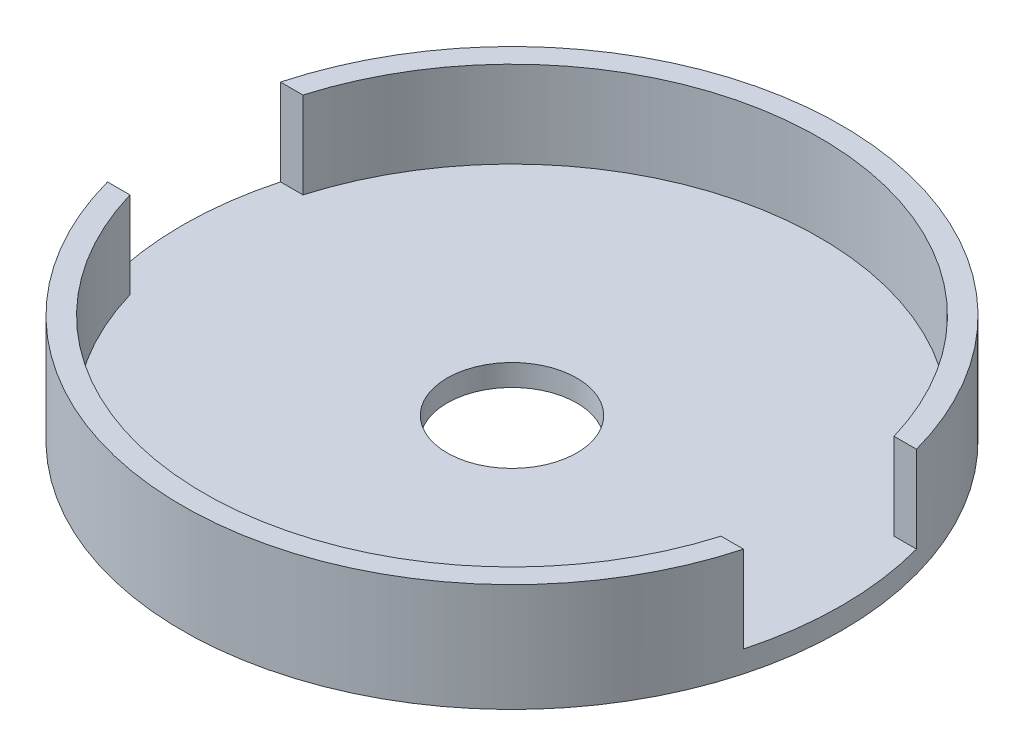
ISO-10303-21;
HEADER;
FILE_DESCRIPTION(('STEP AP214'),'2;1');
FILE_NAME('part.step','',(''),(''),'','','');
FILE_SCHEMA(('AUTOMOTIVE_DESIGN { 1 0 10303 214 1 1 1 1 }'));
ENDSEC;
DATA;
#1=APPLICATION_CONTEXT('core data for automotive mechanical design processes');
#2=APPLICATION_PROTOCOL_DEFINITION('international standard','automotive_design',2000,#1);
#3=PRODUCT_CONTEXT('',#1,'mechanical');
#4=PRODUCT('Part','Part','',(#3));
#5=PRODUCT_RELATED_PRODUCT_CATEGORY('part','',(#4));
#6=PRODUCT_DEFINITION_FORMATION('','',#4);
#7=PRODUCT_DEFINITION_CONTEXT('part definition',#1,'design');
#8=PRODUCT_DEFINITION('design','',#6,#7);
#9=PRODUCT_DEFINITION_SHAPE('','',#8);
#10=(LENGTH_UNIT() NAMED_UNIT(*) SI_UNIT(.MILLI.,.METRE.));
#11=(NAMED_UNIT(*) PLANE_ANGLE_UNIT() SI_UNIT($,.RADIAN.));
#12=(NAMED_UNIT(*) SI_UNIT($,.STERADIAN.) SOLID_ANGLE_UNIT());
#13=UNCERTAINTY_MEASURE_WITH_UNIT(LENGTH_MEASURE(1.E-05),#10,'distance_accuracy_value','');
#14=(GEOMETRIC_REPRESENTATION_CONTEXT(3) GLOBAL_UNCERTAINTY_ASSIGNED_CONTEXT((#13)) GLOBAL_UNIT_ASSIGNED_CONTEXT((#10,
#11,#12)) REPRESENTATION_CONTEXT('',''));
#15=CARTESIAN_POINT('',(0.,0.,0.));
#16=DIRECTION('',(0.,0.,1.));
#17=DIRECTION('',(1.,0.,0.));
#18=AXIS2_PLACEMENT_3D('',#15,#16,#17);
#19=CARTESIAN_POINT('',(-76.2,25.,0.));
#20=DIRECTION('',(0.,1.,0.));
#21=DIRECTION('',(-1.,0.,0.));
#22=AXIS2_PLACEMENT_3D('',#19,#20,#21);
#23=PLANE('',#22);
#24=DIRECTION('',(1.,0.,0.));
#25=VECTOR('',#24,1.);
#26=CARTESIAN_POINT('',(-76.2,25.,20.));
#27=LINE('',#26,#25);
#28=CARTESIAN_POINT('',(-73.5284978766736,25.,20.));
#29=VERTEX_POINT('',#28);
#30=CARTESIAN_POINT('',(-68.3333008130004,25.,20.));
#31=VERTEX_POINT('',#30);
#32=EDGE_CURVE('E177',#29,#31,#27,.T.);
#33=ORIENTED_EDGE('',*,*,#32,.F.);
#34=CARTESIAN_POINT('',(0.,25.,0.));
#35=DIRECTION('',(0.,1.,0.));
#36=DIRECTION('',(-1.,0.,0.));
#37=AXIS2_PLACEMENT_3D('',#34,#35,#36);
#38=CIRCLE('',#37,76.2);
#39=CARTESIAN_POINT('',(73.5284978766736,25.,20.));
#40=VERTEX_POINT('',#39);
#41=EDGE_CURVE('E55',#29,#40,#38,.T.);
#42=ORIENTED_EDGE('',*,*,#41,.T.);
#43=CARTESIAN_POINT('',(68.3333008130004,25.,20.));
#44=VERTEX_POINT('',#43);
#45=EDGE_CURVE('E124',#44,#40,#27,.T.);
#46=ORIENTED_EDGE('',*,*,#45,.F.);
#47=CARTESIAN_POINT('',(0.,25.,0.));
#48=DIRECTION('',(0.,1.,0.));
#49=DIRECTION('',(-1.,0.,0.));
#50=AXIS2_PLACEMENT_3D('',#47,#48,#49);
#51=CIRCLE('',#50,71.2);
#52=EDGE_CURVE('E143',#31,#44,#51,.T.);
#53=ORIENTED_EDGE('',*,*,#52,.F.);
#54=EDGE_LOOP('',(#33,#42,#46,#53));
#55=FACE_BOUND('',#54,.T.);
#56=ADVANCED_FACE('F45',(#55),#23,.T.);
#57=CARTESIAN_POINT('',(0.,4.99999999999999,0.));
#58=DIRECTION('',(0.,1.,0.));
#59=DIRECTION('',(-1.,0.,0.));
#60=AXIS2_PLACEMENT_3D('',#57,#58,#59);
#61=CYLINDRICAL_SURFACE('',#60,71.2);
#62=DIRECTION('',(0.,1.,0.));
#63=VECTOR('',#62,1.);
#64=CARTESIAN_POINT('',(68.3333008130004,5.,20.));
#65=LINE('',#64,#63);
#66=CARTESIAN_POINT('',(68.3333008130003,5.,20.));
#67=VERTEX_POINT('',#66);
#68=EDGE_CURVE('E165',#67,#44,#65,.T.);
#69=ORIENTED_EDGE('',*,*,#68,.F.);
#70=CARTESIAN_POINT('',(0.,4.99999999999999,0.));
#71=DIRECTION('',(0.,1.,0.));
#72=DIRECTION('',(-1.,0.,0.));
#73=AXIS2_PLACEMENT_3D('',#70,#71,#72);
#74=CIRCLE('',#73,71.2);
#75=CARTESIAN_POINT('',(-68.3333008130004,4.99999999999999,20.));
#76=VERTEX_POINT('',#75);
#77=EDGE_CURVE('E152',#76,#67,#74,.T.);
#78=ORIENTED_EDGE('',*,*,#77,.F.);
#79=DIRECTION('',(0.,1.,0.));
#80=VECTOR('',#79,1.);
#81=CARTESIAN_POINT('',(-68.3333008130004,4.99999999999999,20.));
#82=LINE('',#81,#80);
#83=EDGE_CURVE('E137',#31,#76,#82,.F.);
#84=ORIENTED_EDGE('',*,*,#83,.F.);
#85=ORIENTED_EDGE('',*,*,#52,.T.);
#86=EDGE_LOOP('',(#69,#78,#84,#85));
#87=FACE_BOUND('',#86,.T.);
#88=ADVANCED_FACE('F224',(#87),#61,.F.);
#89=CARTESIAN_POINT('',(0.,0.,0.));
#90=DIRECTION('',(0.,-1.,0.));
#91=DIRECTION('',(1.,0.,0.));
#92=AXIS2_PLACEMENT_3D('',#89,#90,#91);
#93=PLANE('',#92);
#94=CARTESIAN_POINT('',(0.,0.,0.));
#95=DIRECTION('',(0.,1.,0.));
#96=DIRECTION('',(-1.,0.,0.));
#97=AXIS2_PLACEMENT_3D('',#94,#95,#96);
#98=CIRCLE('',#97,15.);
#99=CARTESIAN_POINT('',(-15.,0.,0.));
#100=VERTEX_POINT('',#99);
#101=EDGE_CURVE('E188',#100,#100,#98,.T.);
#102=ORIENTED_EDGE('',*,*,#101,.T.);
#103=EDGE_LOOP('',(#102));
#104=FACE_BOUND('',#103,.T.);
#105=CARTESIAN_POINT('',(0.,0.,0.));
#106=DIRECTION('',(0.,1.,0.));
#107=DIRECTION('',(-1.,0.,0.));
#108=AXIS2_PLACEMENT_3D('',#105,#106,#107);
#109=CIRCLE('',#108,76.2);
#110=CARTESIAN_POINT('',(-76.2,0.,0.));
#111=VERTEX_POINT('',#110);
#112=EDGE_CURVE('E11',#111,#111,#109,.T.);
#113=ORIENTED_EDGE('',*,*,#112,.F.);
#114=EDGE_LOOP('',(#113));
#115=FACE_BOUND('',#114,.T.);
#116=ADVANCED_FACE('F47',(#104,#115),#93,.T.);
#117=CARTESIAN_POINT('',(0.,4.99999999999999,0.));
#118=DIRECTION('',(0.,1.,0.));
#119=DIRECTION('',(-1.,0.,0.));
#120=AXIS2_PLACEMENT_3D('',#117,#118,#119);
#121=CYLINDRICAL_SURFACE('',#120,76.2);
#122=DIRECTION('',(0.,1.,0.));
#123=VECTOR('',#122,1.);
#124=CARTESIAN_POINT('',(-73.5284978766736,4.99999999999999,-20.));
#125=LINE('',#124,#123);
#126=CARTESIAN_POINT('',(-73.5284978766736,25.,-20.));
#127=VERTEX_POINT('',#126);
#128=CARTESIAN_POINT('',(-73.5284978766736,5.,-20.));
#129=VERTEX_POINT('',#128);
#130=EDGE_CURVE('E115',#127,#129,#125,.F.);
#131=ORIENTED_EDGE('',*,*,#130,.F.);
#132=CARTESIAN_POINT('',(73.5284978766736,25.,-20.));
#133=VERTEX_POINT('',#132);
#134=EDGE_CURVE('E133',#133,#127,#38,.T.);
#135=ORIENTED_EDGE('',*,*,#134,.F.);
#136=DIRECTION('',(0.,1.,0.));
#137=VECTOR('',#136,1.);
#138=CARTESIAN_POINT('',(73.5284978766736,5.,-20.));
#139=LINE('',#138,#137);
#140=CARTESIAN_POINT('',(73.5284978766736,5.,-20.));
#141=VERTEX_POINT('',#140);
#142=EDGE_CURVE('E138',#141,#133,#139,.T.);
#143=ORIENTED_EDGE('',*,*,#142,.F.);
#144=CARTESIAN_POINT('',(0.,5.,0.));
#145=DIRECTION('',(0.,-1.,0.));
#146=DIRECTION('',(0.,0.,-1.));
#147=AXIS2_PLACEMENT_3D('',#144,#145,#146);
#148=CIRCLE('',#147,76.2);
#149=CARTESIAN_POINT('',(73.5284978766736,5.,20.));
#150=VERTEX_POINT('',#149);
#151=EDGE_CURVE('E158',#150,#141,#148,.F.);
#152=ORIENTED_EDGE('',*,*,#151,.F.);
#153=DIRECTION('',(0.,1.,0.));
#154=VECTOR('',#153,1.);
#155=CARTESIAN_POINT('',(73.5284978766736,5.,20.));
#156=LINE('',#155,#154);
#157=EDGE_CURVE('E159',#40,#150,#156,.F.);
#158=ORIENTED_EDGE('',*,*,#157,.F.);
#159=ORIENTED_EDGE('',*,*,#41,.F.);
#160=DIRECTION('',(0.,1.,0.));
#161=VECTOR('',#160,1.);
#162=CARTESIAN_POINT('',(-73.5284978766736,4.99999999999999,20.));
#163=LINE('',#162,#161);
#164=CARTESIAN_POINT('',(-73.5284978766736,5.,20.));
#165=VERTEX_POINT('',#164);
#166=EDGE_CURVE('E162',#165,#29,#163,.T.);
#167=ORIENTED_EDGE('',*,*,#166,.F.);
#168=EDGE_CURVE('E135',#129,#165,#148,.F.);
#169=ORIENTED_EDGE('',*,*,#168,.F.);
#170=EDGE_LOOP('',(#131,#135,#143,#152,#158,#159,#167,#169));
#171=FACE_BOUND('',#170,.T.);
#172=ORIENTED_EDGE('',*,*,#112,.T.);
#173=EDGE_LOOP('',(#172));
#174=FACE_BOUND('',#173,.T.);
#175=ADVANCED_FACE('F130',(#171,#174),#121,.T.);
#176=DIRECTION('',(1.,0.,0.));
#177=VECTOR('',#176,1.);
#178=CARTESIAN_POINT('',(-76.2,25.,-20.));
#179=LINE('',#178,#177);
#180=CARTESIAN_POINT('',(68.3333008130003,25.,-20.));
#181=VERTEX_POINT('',#180);
#182=EDGE_CURVE('E125',#181,#133,#179,.T.);
#183=ORIENTED_EDGE('',*,*,#182,.T.);
#184=ORIENTED_EDGE('',*,*,#134,.T.);
#185=CARTESIAN_POINT('',(-68.3333008130004,25.,-20.));
#186=VERTEX_POINT('',#185);
#187=EDGE_CURVE('E112',#127,#186,#179,.T.);
#188=ORIENTED_EDGE('',*,*,#187,.T.);
#189=EDGE_CURVE('E149',#181,#186,#51,.T.);
#190=ORIENTED_EDGE('',*,*,#189,.F.);
#191=EDGE_LOOP('',(#183,#184,#188,#190));
#192=FACE_BOUND('',#191,.T.);
#193=ADVANCED_FACE('F141',(#192),#23,.T.);
#194=DIRECTION('',(0.,1.,0.));
#195=VECTOR('',#194,1.);
#196=CARTESIAN_POINT('',(-68.3333008130004,4.99999999999999,-20.));
#197=LINE('',#196,#195);
#198=CARTESIAN_POINT('',(-68.3333008130004,5.,-20.));
#199=VERTEX_POINT('',#198);
#200=EDGE_CURVE('E118',#199,#186,#197,.T.);
#201=ORIENTED_EDGE('',*,*,#200,.F.);
#202=CARTESIAN_POINT('',(68.3333008130004,5.,-20.));
#203=VERTEX_POINT('',#202);
#204=EDGE_CURVE('E155',#203,#199,#74,.T.);
#205=ORIENTED_EDGE('',*,*,#204,.F.);
#206=DIRECTION('',(0.,1.,0.));
#207=VECTOR('',#206,1.);
#208=CARTESIAN_POINT('',(68.3333008130004,5.,-20.));
#209=LINE('',#208,#207);
#210=EDGE_CURVE('E174',#181,#203,#209,.F.);
#211=ORIENTED_EDGE('',*,*,#210,.F.);
#212=ORIENTED_EDGE('',*,*,#189,.T.);
#213=EDGE_LOOP('',(#201,#205,#211,#212));
#214=FACE_BOUND('',#213,.T.);
#215=ADVANCED_FACE('F202',(#214),#61,.F.);
#216=CARTESIAN_POINT('',(-71.2,4.99999999999999,0.));
#217=DIRECTION('',(0.,1.,0.));
#218=DIRECTION('',(-1.,0.,0.));
#219=AXIS2_PLACEMENT_3D('',#216,#217,#218);
#220=PLANE('',#219);
#221=CARTESIAN_POINT('',(0.,4.99999999999999,0.));
#222=DIRECTION('',(0.,1.,0.));
#223=DIRECTION('',(-1.,0.,0.));
#224=AXIS2_PLACEMENT_3D('',#221,#222,#223);
#225=CIRCLE('',#224,15.);
#226=CARTESIAN_POINT('',(-15.,4.99999999999999,0.));
#227=VERTEX_POINT('',#226);
#228=EDGE_CURVE('E49',#227,#227,#225,.T.);
#229=ORIENTED_EDGE('',*,*,#228,.F.);
#230=EDGE_LOOP('',(#229));
#231=FACE_BOUND('',#230,.T.);
#232=ORIENTED_EDGE('',*,*,#204,.T.);
#233=DIRECTION('',(1.,0.,0.));
#234=VECTOR('',#233,1.);
#235=CARTESIAN_POINT('',(-76.2,5.,-20.));
#236=LINE('',#235,#234);
#237=EDGE_CURVE('E183',#129,#199,#236,.T.);
#238=ORIENTED_EDGE('',*,*,#237,.F.);
#239=ORIENTED_EDGE('',*,*,#168,.T.);
#240=DIRECTION('',(1.,0.,0.));
#241=VECTOR('',#240,1.);
#242=CARTESIAN_POINT('',(-76.2,5.,20.));
#243=LINE('',#242,#241);
#244=EDGE_CURVE('E69',#165,#76,#243,.T.);
#245=ORIENTED_EDGE('',*,*,#244,.T.);
#246=ORIENTED_EDGE('',*,*,#77,.T.);
#247=EDGE_CURVE('E178',#67,#150,#243,.T.);
#248=ORIENTED_EDGE('',*,*,#247,.T.);
#249=ORIENTED_EDGE('',*,*,#151,.T.);
#250=EDGE_CURVE('E62',#203,#141,#236,.T.);
#251=ORIENTED_EDGE('',*,*,#250,.F.);
#252=EDGE_LOOP('',(#232,#238,#239,#245,#246,#248,#249,#251));
#253=FACE_BOUND('',#252,.T.);
#254=ADVANCED_FACE('F200',(#231,#253),#220,.T.);
#255=CARTESIAN_POINT('',(-76.2,25.,-20.));
#256=DIRECTION('',(0.,0.,-1.));
#257=DIRECTION('',(0.,1.,0.));
#258=AXIS2_PLACEMENT_3D('',#255,#256,#257);
#259=PLANE('',#258);
#260=ORIENTED_EDGE('',*,*,#130,.T.);
#261=ORIENTED_EDGE('',*,*,#237,.T.);
#262=ORIENTED_EDGE('',*,*,#200,.T.);
#263=ORIENTED_EDGE('',*,*,#187,.F.);
#264=EDGE_LOOP('',(#260,#261,#262,#263));
#265=FACE_BOUND('',#264,.T.);
#266=ADVANCED_FACE('F114',(#265),#259,.F.);
#267=CARTESIAN_POINT('',(-76.2,25.,20.));
#268=DIRECTION('',(0.,0.,1.));
#269=DIRECTION('',(0.,-1.,0.));
#270=AXIS2_PLACEMENT_3D('',#267,#268,#269);
#271=PLANE('',#270);
#272=ORIENTED_EDGE('',*,*,#166,.T.);
#273=ORIENTED_EDGE('',*,*,#32,.T.);
#274=ORIENTED_EDGE('',*,*,#83,.T.);
#275=ORIENTED_EDGE('',*,*,#244,.F.);
#276=EDGE_LOOP('',(#272,#273,#274,#275));
#277=FACE_BOUND('',#276,.T.);
#278=ADVANCED_FACE('F230',(#277),#271,.F.);
#279=ORIENTED_EDGE('',*,*,#157,.T.);
#280=ORIENTED_EDGE('',*,*,#247,.F.);
#281=ORIENTED_EDGE('',*,*,#68,.T.);
#282=ORIENTED_EDGE('',*,*,#45,.T.);
#283=EDGE_LOOP('',(#279,#280,#281,#282));
#284=FACE_BOUND('',#283,.T.);
#285=ADVANCED_FACE('F221',(#284),#271,.F.);
#286=ORIENTED_EDGE('',*,*,#142,.T.);
#287=ORIENTED_EDGE('',*,*,#182,.F.);
#288=ORIENTED_EDGE('',*,*,#210,.T.);
#289=ORIENTED_EDGE('',*,*,#250,.T.);
#290=EDGE_LOOP('',(#286,#287,#288,#289));
#291=FACE_BOUND('',#290,.T.);
#292=ADVANCED_FACE('F214',(#291),#259,.F.);
#293=CARTESIAN_POINT('',(0.,0.,0.));
#294=DIRECTION('',(0.,1.,0.));
#295=DIRECTION('',(-1.,0.,0.));
#296=AXIS2_PLACEMENT_3D('',#293,#294,#295);
#297=CYLINDRICAL_SURFACE('',#296,15.);
#298=ORIENTED_EDGE('',*,*,#228,.T.);
#299=EDGE_LOOP('',(#298));
#300=FACE_BOUND('',#299,.T.);
#301=ORIENTED_EDGE('',*,*,#101,.F.);
#302=EDGE_LOOP('',(#301));
#303=FACE_BOUND('',#302,.T.);
#304=ADVANCED_FACE('F197',(#300,#303),#297,.F.);
#305=CLOSED_SHELL('',(#56,#88,#116,#175,#193,#215,#254,#266,#278,#285,#292,#304));
#306=MANIFOLD_SOLID_BREP('B2',#305);
#307=ADVANCED_BREP_SHAPE_REPRESENTATION('',(#18,#306),#14);
#308=SHAPE_DEFINITION_REPRESENTATION(#9,#307);
ENDSEC;
END-ISO-10303-21;
